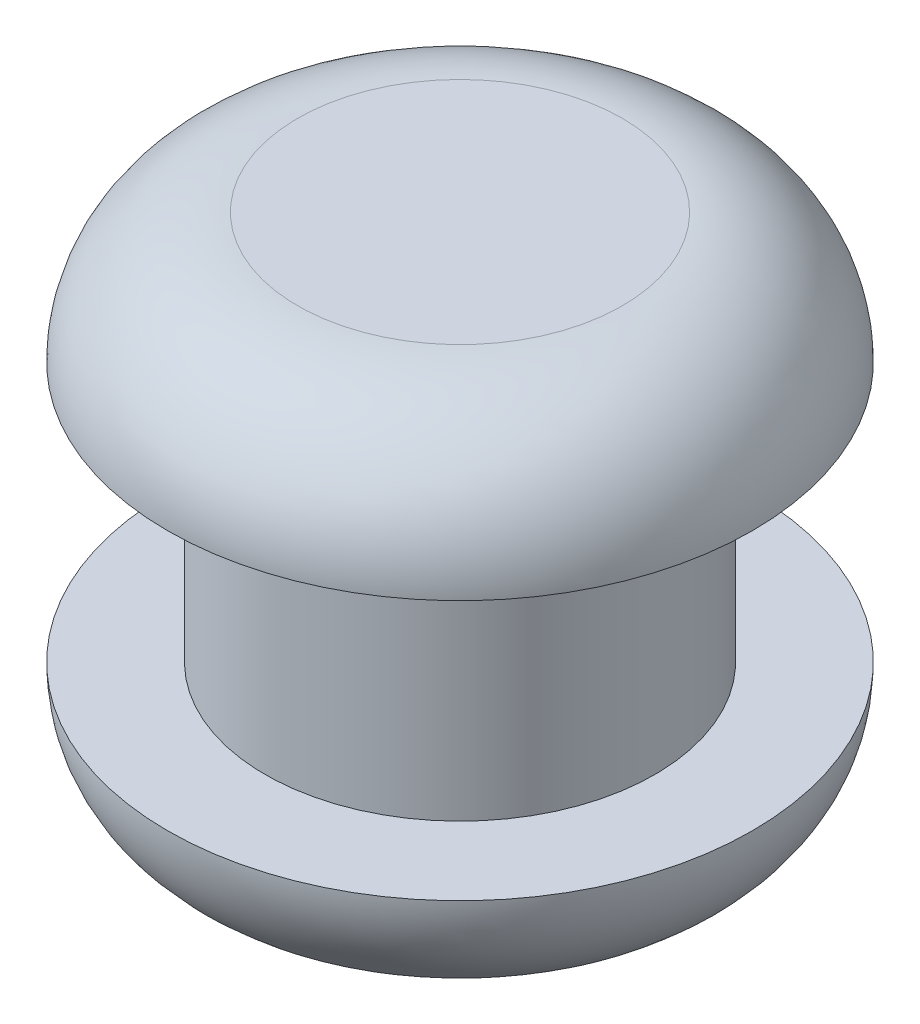
ISO-10303-21;
HEADER;
FILE_DESCRIPTION(('STEP AP214'),'2;1');
FILE_NAME('part.step','',(''),(''),'','','');
FILE_SCHEMA(('AUTOMOTIVE_DESIGN { 1 0 10303 214 1 1 1 1 }'));
ENDSEC;
DATA;
#1=APPLICATION_CONTEXT('core data for automotive mechanical design processes');
#2=APPLICATION_PROTOCOL_DEFINITION('international standard','automotive_design',2000,#1);
#3=PRODUCT_CONTEXT('',#1,'mechanical');
#4=PRODUCT('Part','Part','',(#3));
#5=PRODUCT_RELATED_PRODUCT_CATEGORY('part','',(#4));
#6=PRODUCT_DEFINITION_FORMATION('','',#4);
#7=PRODUCT_DEFINITION_CONTEXT('part definition',#1,'design');
#8=PRODUCT_DEFINITION('design','',#6,#7);
#9=PRODUCT_DEFINITION_SHAPE('','',#8);
#10=(LENGTH_UNIT() NAMED_UNIT(*) SI_UNIT(.MILLI.,.METRE.));
#11=(NAMED_UNIT(*) PLANE_ANGLE_UNIT() SI_UNIT($,.RADIAN.));
#12=(NAMED_UNIT(*) SI_UNIT($,.STERADIAN.) SOLID_ANGLE_UNIT());
#13=UNCERTAINTY_MEASURE_WITH_UNIT(LENGTH_MEASURE(1.E-05),#10,'distance_accuracy_value','');
#14=(GEOMETRIC_REPRESENTATION_CONTEXT(3) GLOBAL_UNCERTAINTY_ASSIGNED_CONTEXT((#13)) GLOBAL_UNIT_ASSIGNED_CONTEXT((#10,
#11,#12)) REPRESENTATION_CONTEXT('',''));
#15=CARTESIAN_POINT('',(0.,0.,0.));
#16=DIRECTION('',(0.,0.,1.));
#17=DIRECTION('',(1.,0.,0.));
#18=AXIS2_PLACEMENT_3D('',#15,#16,#17);
#19=CARTESIAN_POINT('',(0.,2.,3.));
#20=DIRECTION('',(0.,1.,0.));
#21=DIRECTION('',(0.,0.,1.));
#22=AXIS2_PLACEMENT_3D('',#19,#20,#21);
#23=PLANE('',#22);
#24=CARTESIAN_POINT('',(0.,2.,0.));
#25=DIRECTION('',(0.,-1.,0.));
#26=DIRECTION('',(0.,0.,-1.));
#27=AXIS2_PLACEMENT_3D('',#24,#25,#26);
#28=CIRCLE('',#27,3.);
#29=CARTESIAN_POINT('',(0.,2.,-3.));
#30=VERTEX_POINT('',#29);
#31=EDGE_CURVE('E61',#30,#30,#28,.T.);
#32=ORIENTED_EDGE('',*,*,#31,.F.);
#33=EDGE_LOOP('',(#32));
#34=FACE_BOUND('',#33,.T.);
#35=CARTESIAN_POINT('',(0.,2.,0.));
#36=DIRECTION('',(0.,-1.,0.));
#37=DIRECTION('',(0.,0.,-1.));
#38=AXIS2_PLACEMENT_3D('',#35,#36,#37);
#39=CIRCLE('',#38,4.5);
#40=CARTESIAN_POINT('',(0.,2.,-4.5));
#41=VERTEX_POINT('',#40);
#42=EDGE_CURVE('E10',#41,#41,#39,.T.);
#43=ORIENTED_EDGE('',*,*,#42,.T.);
#44=EDGE_LOOP('',(#43));
#45=FACE_BOUND('',#44,.T.);
#46=ADVANCED_FACE('F39',(#34,#45),#23,.F.);
#47=CARTESIAN_POINT('',(0.,2.,0.));
#48=DIRECTION('',(0.,-1.,0.));
#49=DIRECTION('',(0.,0.,-1.));
#50=AXIS2_PLACEMENT_3D('',#47,#48,#49);
#51=TOROIDAL_SURFACE('',#50,2.5,2.);
#52=ORIENTED_EDGE('',*,*,#42,.F.);
#53=EDGE_LOOP('',(#52));
#54=FACE_BOUND('',#53,.T.);
#55=CARTESIAN_POINT('',(0.,4.,0.));
#56=DIRECTION('',(0.,-1.,0.));
#57=DIRECTION('',(0.,0.,-1.));
#58=AXIS2_PLACEMENT_3D('',#55,#56,#57);
#59=CIRCLE('',#58,2.5);
#60=CARTESIAN_POINT('',(0.,4.,-2.5));
#61=VERTEX_POINT('',#60);
#62=EDGE_CURVE('E44',#61,#61,#59,.T.);
#63=ORIENTED_EDGE('',*,*,#62,.T.);
#64=EDGE_LOOP('',(#63));
#65=FACE_BOUND('',#64,.T.);
#66=ADVANCED_FACE('F66',(#54,#65),#51,.T.);
#67=CARTESIAN_POINT('',(0.,4.,2.5));
#68=DIRECTION('',(0.,-1.,0.));
#69=DIRECTION('',(0.,0.,-1.));
#70=AXIS2_PLACEMENT_3D('',#67,#68,#69);
#71=PLANE('',#70);
#72=ORIENTED_EDGE('',*,*,#62,.F.);
#73=EDGE_LOOP('',(#72));
#74=FACE_BOUND('',#73,.T.);
#75=ADVANCED_FACE('F72',(#74),#71,.F.);
#76=CARTESIAN_POINT('',(0.,-4.,2.5));
#77=DIRECTION('',(0.,1.,0.));
#78=DIRECTION('',(0.,0.,1.));
#79=AXIS2_PLACEMENT_3D('',#76,#77,#78);
#80=PLANE('',#79);
#81=CARTESIAN_POINT('',(0.,-4.,0.));
#82=DIRECTION('',(0.,-1.,0.));
#83=DIRECTION('',(0.,0.,-1.));
#84=AXIS2_PLACEMENT_3D('',#81,#82,#83);
#85=CIRCLE('',#84,2.5);
#86=CARTESIAN_POINT('',(0.,-4.,-2.5));
#87=VERTEX_POINT('',#86);
#88=EDGE_CURVE('E47',#87,#87,#85,.T.);
#89=ORIENTED_EDGE('',*,*,#88,.T.);
#90=EDGE_LOOP('',(#89));
#91=FACE_BOUND('',#90,.T.);
#92=ADVANCED_FACE('F77',(#91),#80,.F.);
#93=CARTESIAN_POINT('',(0.,-2.,0.));
#94=DIRECTION('',(0.,-1.,0.));
#95=DIRECTION('',(0.,0.,-1.));
#96=AXIS2_PLACEMENT_3D('',#93,#94,#95);
#97=TOROIDAL_SURFACE('',#96,2.5,2.);
#98=ORIENTED_EDGE('',*,*,#88,.F.);
#99=EDGE_LOOP('',(#98));
#100=FACE_BOUND('',#99,.T.);
#101=CARTESIAN_POINT('',(0.,-2.,0.));
#102=DIRECTION('',(0.,-1.,0.));
#103=DIRECTION('',(0.,0.,-1.));
#104=AXIS2_PLACEMENT_3D('',#101,#102,#103);
#105=CIRCLE('',#104,4.5);
#106=CARTESIAN_POINT('',(0.,-2.,-4.5));
#107=VERTEX_POINT('',#106);
#108=EDGE_CURVE('E52',#107,#107,#105,.T.);
#109=ORIENTED_EDGE('',*,*,#108,.T.);
#110=EDGE_LOOP('',(#109));
#111=FACE_BOUND('',#110,.T.);
#112=ADVANCED_FACE('F81',(#100,#111),#97,.T.);
#113=CARTESIAN_POINT('',(0.,-2.,3.));
#114=DIRECTION('',(0.,-1.,0.));
#115=DIRECTION('',(0.,0.,-1.));
#116=AXIS2_PLACEMENT_3D('',#113,#114,#115);
#117=PLANE('',#116);
#118=ORIENTED_EDGE('',*,*,#108,.F.);
#119=EDGE_LOOP('',(#118));
#120=FACE_BOUND('',#119,.T.);
#121=CARTESIAN_POINT('',(0.,-2.,0.));
#122=DIRECTION('',(0.,-1.,0.));
#123=DIRECTION('',(0.,0.,-1.));
#124=AXIS2_PLACEMENT_3D('',#121,#122,#123);
#125=CIRCLE('',#124,3.);
#126=CARTESIAN_POINT('',(0.,-2.,-3.));
#127=VERTEX_POINT('',#126);
#128=EDGE_CURVE('E59',#127,#127,#125,.T.);
#129=ORIENTED_EDGE('',*,*,#128,.T.);
#130=EDGE_LOOP('',(#129));
#131=FACE_BOUND('',#130,.T.);
#132=ADVANCED_FACE('F90',(#120,#131),#117,.F.);
#133=CARTESIAN_POINT('',(0.,-8.54659501082859,0.));
#134=DIRECTION('',(0.,-1.,0.));
#135=DIRECTION('',(0.,0.,-1.));
#136=AXIS2_PLACEMENT_3D('',#133,#134,#135);
#137=CYLINDRICAL_SURFACE('',#136,3.);
#138=ORIENTED_EDGE('',*,*,#128,.F.);
#139=EDGE_LOOP('',(#138));
#140=FACE_BOUND('',#139,.T.);
#141=ORIENTED_EDGE('',*,*,#31,.T.);
#142=EDGE_LOOP('',(#141));
#143=FACE_BOUND('',#142,.T.);
#144=ADVANCED_FACE('F65',(#140,#143),#137,.T.);
#145=CLOSED_SHELL('',(#46,#66,#75,#92,#112,#132,#144));
#146=MANIFOLD_SOLID_BREP('B2',#145);
#147=ADVANCED_BREP_SHAPE_REPRESENTATION('',(#18,#146),#14);
#148=SHAPE_DEFINITION_REPRESENTATION(#9,#147);
ENDSEC;
END-ISO-10303-21;
